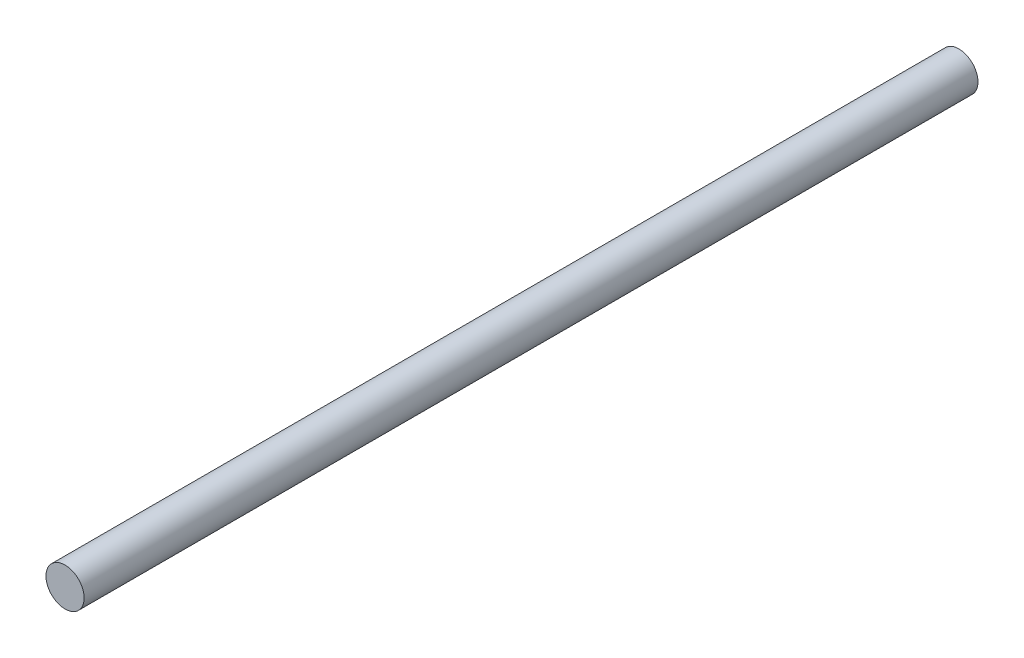
ISO-10303-21;
HEADER;
FILE_DESCRIPTION(('STEP AP214'),'2;1');
FILE_NAME('part.step','',(''),(''),'','','');
FILE_SCHEMA(('AUTOMOTIVE_DESIGN { 1 0 10303 214 1 1 1 1 }'));
ENDSEC;
DATA;
#1=APPLICATION_CONTEXT('core data for automotive mechanical design processes');
#2=APPLICATION_PROTOCOL_DEFINITION('international standard','automotive_design',2000,#1);
#3=PRODUCT_CONTEXT('',#1,'mechanical');
#4=PRODUCT('Part','Part','',(#3));
#5=PRODUCT_RELATED_PRODUCT_CATEGORY('part','',(#4));
#6=PRODUCT_DEFINITION_FORMATION('','',#4);
#7=PRODUCT_DEFINITION_CONTEXT('part definition',#1,'design');
#8=PRODUCT_DEFINITION('design','',#6,#7);
#9=PRODUCT_DEFINITION_SHAPE('','',#8);
#10=(LENGTH_UNIT() NAMED_UNIT(*) SI_UNIT(.MILLI.,.METRE.));
#11=(NAMED_UNIT(*) PLANE_ANGLE_UNIT() SI_UNIT($,.RADIAN.));
#12=(NAMED_UNIT(*) SI_UNIT($,.STERADIAN.) SOLID_ANGLE_UNIT());
#13=UNCERTAINTY_MEASURE_WITH_UNIT(LENGTH_MEASURE(1.E-05),#10,'distance_accuracy_value','');
#14=(GEOMETRIC_REPRESENTATION_CONTEXT(3) GLOBAL_UNCERTAINTY_ASSIGNED_CONTEXT((#13)) GLOBAL_UNIT_ASSIGNED_CONTEXT((#10,
#11,#12)) REPRESENTATION_CONTEXT('',''));
#15=CARTESIAN_POINT('',(0.,0.,0.));
#16=DIRECTION('',(0.,0.,1.));
#17=DIRECTION('',(1.,0.,0.));
#18=AXIS2_PLACEMENT_3D('',#15,#16,#17);
#19=CARTESIAN_POINT('',(0.,0.,152.24));
#20=DIRECTION('',(0.,0.,-1.));
#21=DIRECTION('',(-1.,0.,0.));
#22=AXIS2_PLACEMENT_3D('',#19,#20,#21);
#23=CYLINDRICAL_SURFACE('',#22,3.25);
#24=CARTESIAN_POINT('',(0.,0.,152.24));
#25=DIRECTION('',(0.,0.,1.));
#26=DIRECTION('',(1.,0.,0.));
#27=AXIS2_PLACEMENT_3D('',#24,#25,#26);
#28=CIRCLE('',#27,3.25);
#29=CARTESIAN_POINT('',(3.25,0.,152.24));
#30=VERTEX_POINT('',#29);
#31=EDGE_CURVE('E10',#30,#30,#28,.T.);
#32=ORIENTED_EDGE('',*,*,#31,.F.);
#33=EDGE_LOOP('',(#32));
#34=FACE_BOUND('',#33,.T.);
#35=CARTESIAN_POINT('',(0.,0.,0.));
#36=DIRECTION('',(0.,0.,1.));
#37=DIRECTION('',(1.,0.,0.));
#38=AXIS2_PLACEMENT_3D('',#35,#36,#37);
#39=CIRCLE('',#38,3.25);
#40=CARTESIAN_POINT('',(3.25,0.,0.));
#41=VERTEX_POINT('',#40);
#42=EDGE_CURVE('E34',#41,#41,#39,.T.);
#43=ORIENTED_EDGE('',*,*,#42,.T.);
#44=EDGE_LOOP('',(#43));
#45=FACE_BOUND('',#44,.T.);
#46=ADVANCED_FACE('F31',(#34,#45),#23,.T.);
#47=CARTESIAN_POINT('',(0.,0.,152.24));
#48=DIRECTION('',(0.,0.,1.));
#49=DIRECTION('',(1.,0.,0.));
#50=AXIS2_PLACEMENT_3D('',#47,#48,#49);
#51=PLANE('',#50);
#52=ORIENTED_EDGE('',*,*,#31,.T.);
#53=EDGE_LOOP('',(#52));
#54=FACE_BOUND('',#53,.T.);
#55=ADVANCED_FACE('F46',(#54),#51,.T.);
#56=CARTESIAN_POINT('',(0.,0.,0.));
#57=DIRECTION('',(0.,0.,1.));
#58=DIRECTION('',(1.,0.,0.));
#59=AXIS2_PLACEMENT_3D('',#56,#57,#58);
#60=PLANE('',#59);
#61=ORIENTED_EDGE('',*,*,#42,.F.);
#62=EDGE_LOOP('',(#61));
#63=FACE_BOUND('',#62,.T.);
#64=ADVANCED_FACE('F44',(#63),#60,.F.);
#65=CLOSED_SHELL('',(#46,#55,#64));
#66=MANIFOLD_SOLID_BREP('B2',#65);
#67=ADVANCED_BREP_SHAPE_REPRESENTATION('',(#18,#66),#14);
#68=SHAPE_DEFINITION_REPRESENTATION(#9,#67);
ENDSEC;
END-ISO-10303-21;
